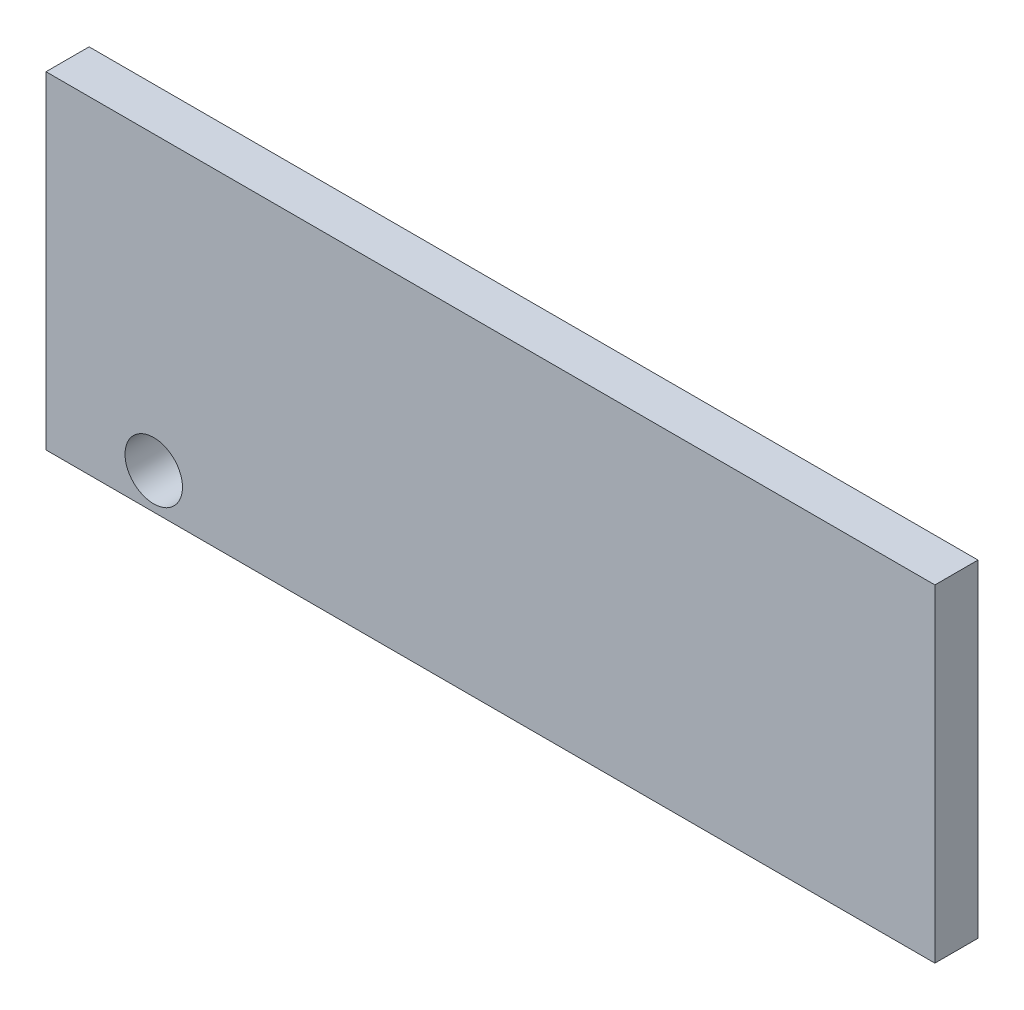
ISO-10303-21;
HEADER;
FILE_DESCRIPTION(('STEP AP214'),'2;1');
FILE_NAME('part.step','',(''),(''),'','','');
FILE_SCHEMA(('AUTOMOTIVE_DESIGN { 1 0 10303 214 1 1 1 1 }'));
ENDSEC;
DATA;
#1=APPLICATION_CONTEXT('core data for automotive mechanical design processes');
#2=APPLICATION_PROTOCOL_DEFINITION('international standard','automotive_design',2000,#1);
#3=PRODUCT_CONTEXT('',#1,'mechanical');
#4=PRODUCT('Part','Part','',(#3));
#5=PRODUCT_RELATED_PRODUCT_CATEGORY('part','',(#4));
#6=PRODUCT_DEFINITION_FORMATION('','',#4);
#7=PRODUCT_DEFINITION_CONTEXT('part definition',#1,'design');
#8=PRODUCT_DEFINITION('design','',#6,#7);
#9=PRODUCT_DEFINITION_SHAPE('','',#8);
#10=(LENGTH_UNIT() NAMED_UNIT(*) SI_UNIT(.MILLI.,.METRE.));
#11=(NAMED_UNIT(*) PLANE_ANGLE_UNIT() SI_UNIT($,.RADIAN.));
#12=(NAMED_UNIT(*) SI_UNIT($,.STERADIAN.) SOLID_ANGLE_UNIT());
#13=UNCERTAINTY_MEASURE_WITH_UNIT(LENGTH_MEASURE(1.E-05),#10,'distance_accuracy_value','');
#14=(GEOMETRIC_REPRESENTATION_CONTEXT(3) GLOBAL_UNCERTAINTY_ASSIGNED_CONTEXT((#13)) GLOBAL_UNIT_ASSIGNED_CONTEXT((#10,
#11,#12)) REPRESENTATION_CONTEXT('',''));
#15=CARTESIAN_POINT('',(0.,0.,0.));
#16=DIRECTION('',(0.,0.,1.));
#17=DIRECTION('',(1.,0.,0.));
#18=AXIS2_PLACEMENT_3D('',#15,#16,#17);
#19=CARTESIAN_POINT('',(0.,0.,6.));
#20=DIRECTION('',(0.,0.,1.));
#21=DIRECTION('',(1.,0.,0.));
#22=AXIS2_PLACEMENT_3D('',#19,#20,#21);
#23=PLANE('',#22);
#24=DIRECTION('',(0.,1.,0.));
#25=VECTOR('',#24,1.);
#26=CARTESIAN_POINT('',(61.8799750818066,22.8041936932662,6.));
#27=LINE('',#26,#25);
#28=CARTESIAN_POINT('',(61.8799750818066,-22.8041936932662,6.));
#29=VERTEX_POINT('',#28);
#30=CARTESIAN_POINT('',(61.8799750818066,22.8041936932662,6.));
#31=VERTEX_POINT('',#30);
#32=EDGE_CURVE('E85',#29,#31,#27,.T.);
#33=ORIENTED_EDGE('',*,*,#32,.T.);
#34=DIRECTION('',(-1.,0.,0.));
#35=VECTOR('',#34,1.);
#36=CARTESIAN_POINT('',(-61.8799750818066,22.8041936932662,6.));
#37=LINE('',#36,#35);
#38=CARTESIAN_POINT('',(-61.8799750818066,22.8041936932662,6.));
#39=VERTEX_POINT('',#38);
#40=EDGE_CURVE('E80',#31,#39,#37,.T.);
#41=ORIENTED_EDGE('',*,*,#40,.T.);
#42=DIRECTION('',(0.,-1.,0.));
#43=VECTOR('',#42,1.);
#44=CARTESIAN_POINT('',(-61.8799750818066,22.8041936932662,6.));
#45=LINE('',#44,#43);
#46=CARTESIAN_POINT('',(-61.8799750818066,-22.8041936932662,6.));
#47=VERTEX_POINT('',#46);
#48=EDGE_CURVE('E83',#39,#47,#45,.T.);
#49=ORIENTED_EDGE('',*,*,#48,.T.);
#50=DIRECTION('',(1.,0.,0.));
#51=VECTOR('',#50,1.);
#52=CARTESIAN_POINT('',(-61.8799750818066,-22.8041936932662,6.));
#53=LINE('',#52,#51);
#54=EDGE_CURVE('E50',#47,#29,#53,.T.);
#55=ORIENTED_EDGE('',*,*,#54,.T.);
#56=EDGE_LOOP('',(#33,#41,#49,#55));
#57=FACE_BOUND('',#56,.T.);
#58=CARTESIAN_POINT('',(-46.8799750818066,-17.8041936932662,6.));
#59=DIRECTION('',(0.,0.,1.));
#60=DIRECTION('',(1.,0.,0.));
#61=AXIS2_PLACEMENT_3D('',#58,#59,#60);
#62=CIRCLE('',#61,4.);
#63=CARTESIAN_POINT('',(-42.8799750818066,-17.8041936932662,6.));
#64=VERTEX_POINT('',#63);
#65=EDGE_CURVE('E100',#64,#64,#62,.T.);
#66=ORIENTED_EDGE('',*,*,#65,.F.);
#67=EDGE_LOOP('',(#66));
#68=FACE_BOUND('',#67,.T.);
#69=ADVANCED_FACE('F33',(#57,#68),#23,.T.);
#70=CARTESIAN_POINT('',(0.,0.,0.));
#71=DIRECTION('',(0.,0.,1.));
#72=DIRECTION('',(1.,0.,0.));
#73=AXIS2_PLACEMENT_3D('',#70,#71,#72);
#74=PLANE('',#73);
#75=DIRECTION('',(0.,1.,0.));
#76=VECTOR('',#75,1.);
#77=CARTESIAN_POINT('',(61.8799750818066,22.8041936932662,0.));
#78=LINE('',#77,#76);
#79=CARTESIAN_POINT('',(61.8799750818066,-22.8041936932662,0.));
#80=VERTEX_POINT('',#79);
#81=CARTESIAN_POINT('',(61.8799750818066,22.8041936932662,0.));
#82=VERTEX_POINT('',#81);
#83=EDGE_CURVE('E97',#80,#82,#78,.T.);
#84=ORIENTED_EDGE('',*,*,#83,.F.);
#85=DIRECTION('',(1.,0.,0.));
#86=VECTOR('',#85,1.);
#87=CARTESIAN_POINT('',(-61.8799750818066,-22.8041936932662,0.));
#88=LINE('',#87,#86);
#89=CARTESIAN_POINT('',(-61.8799750818066,-22.8041936932662,0.));
#90=VERTEX_POINT('',#89);
#91=EDGE_CURVE('E73',#90,#80,#88,.T.);
#92=ORIENTED_EDGE('',*,*,#91,.F.);
#93=DIRECTION('',(0.,-1.,0.));
#94=VECTOR('',#93,1.);
#95=CARTESIAN_POINT('',(-61.8799750818066,22.8041936932662,0.));
#96=LINE('',#95,#94);
#97=CARTESIAN_POINT('',(-61.8799750818066,22.8041936932662,0.));
#98=VERTEX_POINT('',#97);
#99=EDGE_CURVE('E67',#98,#90,#96,.T.);
#100=ORIENTED_EDGE('',*,*,#99,.F.);
#101=DIRECTION('',(-1.,0.,0.));
#102=VECTOR('',#101,1.);
#103=CARTESIAN_POINT('',(-61.8799750818066,22.8041936932662,0.));
#104=LINE('',#103,#102);
#105=EDGE_CURVE('E89',#82,#98,#104,.T.);
#106=ORIENTED_EDGE('',*,*,#105,.F.);
#107=EDGE_LOOP('',(#84,#92,#100,#106));
#108=FACE_BOUND('',#107,.T.);
#109=CARTESIAN_POINT('',(-46.8799750818066,-17.8041936932662,0.));
#110=DIRECTION('',(0.,0.,1.));
#111=DIRECTION('',(1.,0.,0.));
#112=AXIS2_PLACEMENT_3D('',#109,#110,#111);
#113=CIRCLE('',#112,4.);
#114=CARTESIAN_POINT('',(-42.8799750818066,-17.8041936932662,0.));
#115=VERTEX_POINT('',#114);
#116=EDGE_CURVE('E112',#115,#115,#113,.T.);
#117=ORIENTED_EDGE('',*,*,#116,.T.);
#118=EDGE_LOOP('',(#117));
#119=FACE_BOUND('',#118,.T.);
#120=ADVANCED_FACE('F108',(#108,#119),#74,.F.);
#121=CARTESIAN_POINT('',(61.8799750818066,22.8041936932662,6.));
#122=DIRECTION('',(-1.,0.,0.));
#123=DIRECTION('',(0.,0.,1.));
#124=AXIS2_PLACEMENT_3D('',#121,#122,#123);
#125=PLANE('',#124);
#126=ORIENTED_EDGE('',*,*,#83,.T.);
#127=DIRECTION('',(0.,0.,-1.));
#128=VECTOR('',#127,1.);
#129=CARTESIAN_POINT('',(61.8799750818066,22.8041936932662,6.));
#130=LINE('',#129,#128);
#131=EDGE_CURVE('E11',#31,#82,#130,.T.);
#132=ORIENTED_EDGE('',*,*,#131,.F.);
#133=ORIENTED_EDGE('',*,*,#32,.F.);
#134=DIRECTION('',(0.,0.,-1.));
#135=VECTOR('',#134,1.);
#136=CARTESIAN_POINT('',(61.8799750818066,-22.8041936932662,6.));
#137=LINE('',#136,#135);
#138=EDGE_CURVE('E93',#29,#80,#137,.T.);
#139=ORIENTED_EDGE('',*,*,#138,.T.);
#140=EDGE_LOOP('',(#126,#132,#133,#139));
#141=FACE_BOUND('',#140,.T.);
#142=ADVANCED_FACE('F35',(#141),#125,.F.);
#143=CARTESIAN_POINT('',(-61.8799750818066,22.8041936932662,6.));
#144=DIRECTION('',(0.,-1.,0.));
#145=DIRECTION('',(0.,0.,-1.));
#146=AXIS2_PLACEMENT_3D('',#143,#144,#145);
#147=PLANE('',#146);
#148=ORIENTED_EDGE('',*,*,#105,.T.);
#149=DIRECTION('',(0.,0.,-1.));
#150=VECTOR('',#149,1.);
#151=CARTESIAN_POINT('',(-61.8799750818066,22.8041936932662,6.));
#152=LINE('',#151,#150);
#153=EDGE_CURVE('E42',#39,#98,#152,.T.);
#154=ORIENTED_EDGE('',*,*,#153,.F.);
#155=ORIENTED_EDGE('',*,*,#40,.F.);
#156=ORIENTED_EDGE('',*,*,#131,.T.);
#157=EDGE_LOOP('',(#148,#154,#155,#156));
#158=FACE_BOUND('',#157,.T.);
#159=ADVANCED_FACE('F88',(#158),#147,.F.);
#160=CARTESIAN_POINT('',(-61.8799750818066,22.8041936932662,6.));
#161=DIRECTION('',(1.,0.,0.));
#162=DIRECTION('',(0.,0.,-1.));
#163=AXIS2_PLACEMENT_3D('',#160,#161,#162);
#164=PLANE('',#163);
#165=ORIENTED_EDGE('',*,*,#99,.T.);
#166=DIRECTION('',(0.,0.,-1.));
#167=VECTOR('',#166,1.);
#168=CARTESIAN_POINT('',(-61.8799750818066,-22.8041936932662,6.));
#169=LINE('',#168,#167);
#170=EDGE_CURVE('E90',#47,#90,#169,.T.);
#171=ORIENTED_EDGE('',*,*,#170,.F.);
#172=ORIENTED_EDGE('',*,*,#48,.F.);
#173=ORIENTED_EDGE('',*,*,#153,.T.);
#174=EDGE_LOOP('',(#165,#171,#172,#173));
#175=FACE_BOUND('',#174,.T.);
#176=ADVANCED_FACE('F91',(#175),#164,.F.);
#177=CARTESIAN_POINT('',(-61.8799750818066,-22.8041936932662,6.));
#178=DIRECTION('',(0.,1.,0.));
#179=DIRECTION('',(0.,0.,1.));
#180=AXIS2_PLACEMENT_3D('',#177,#178,#179);
#181=PLANE('',#180);
#182=ORIENTED_EDGE('',*,*,#91,.T.);
#183=ORIENTED_EDGE('',*,*,#138,.F.);
#184=ORIENTED_EDGE('',*,*,#54,.F.);
#185=ORIENTED_EDGE('',*,*,#170,.T.);
#186=EDGE_LOOP('',(#182,#183,#184,#185));
#187=FACE_BOUND('',#186,.T.);
#188=ADVANCED_FACE('F105',(#187),#181,.F.);
#189=CARTESIAN_POINT('',(-46.8799750818066,-17.8041936932662,6.));
#190=DIRECTION('',(0.,0.,-1.));
#191=DIRECTION('',(-1.,0.,0.));
#192=AXIS2_PLACEMENT_3D('',#189,#190,#191);
#193=CYLINDRICAL_SURFACE('',#192,4.);
#194=ORIENTED_EDGE('',*,*,#65,.T.);
#195=EDGE_LOOP('',(#194));
#196=FACE_BOUND('',#195,.T.);
#197=ORIENTED_EDGE('',*,*,#116,.F.);
#198=EDGE_LOOP('',(#197));
#199=FACE_BOUND('',#198,.T.);
#200=ADVANCED_FACE('F118',(#196,#199),#193,.F.);
#201=CLOSED_SHELL('',(#69,#120,#142,#159,#176,#188,#200));
#202=MANIFOLD_SOLID_BREP('B2',#201);
#203=ADVANCED_BREP_SHAPE_REPRESENTATION('',(#18,#202),#14);
#204=SHAPE_DEFINITION_REPRESENTATION(#9,#203);
ENDSEC;
END-ISO-10303-21;
